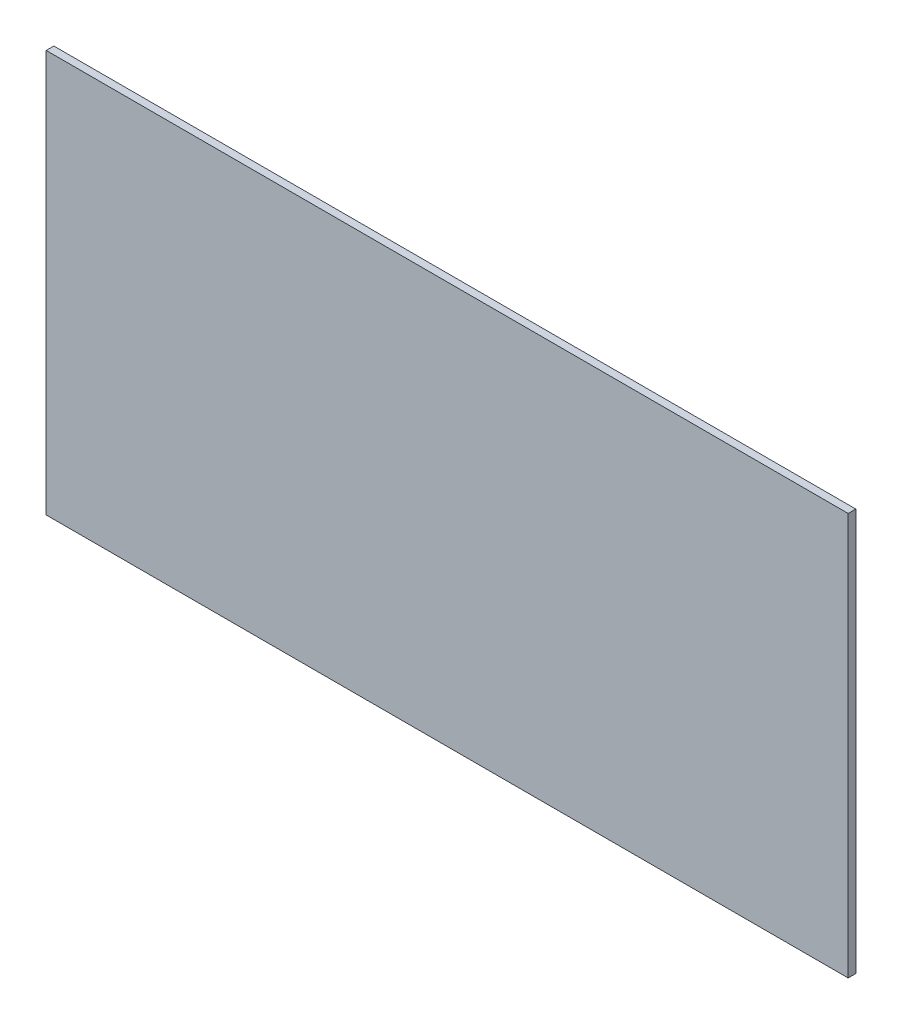
ISO-10303-21;
HEADER;
FILE_DESCRIPTION(('STEP AP214'),'2;1');
FILE_NAME('part.step','',(''),(''),'','','');
FILE_SCHEMA(('AUTOMOTIVE_DESIGN { 1 0 10303 214 1 1 1 1 }'));
ENDSEC;
DATA;
#1=APPLICATION_CONTEXT('core data for automotive mechanical design processes');
#2=APPLICATION_PROTOCOL_DEFINITION('international standard','automotive_design',2000,#1);
#3=PRODUCT_CONTEXT('',#1,'mechanical');
#4=PRODUCT('Part','Part','',(#3));
#5=PRODUCT_RELATED_PRODUCT_CATEGORY('part','',(#4));
#6=PRODUCT_DEFINITION_FORMATION('','',#4);
#7=PRODUCT_DEFINITION_CONTEXT('part definition',#1,'design');
#8=PRODUCT_DEFINITION('design','',#6,#7);
#9=PRODUCT_DEFINITION_SHAPE('','',#8);
#10=(LENGTH_UNIT() NAMED_UNIT(*) SI_UNIT(.MILLI.,.METRE.));
#11=(NAMED_UNIT(*) PLANE_ANGLE_UNIT() SI_UNIT($,.RADIAN.));
#12=(NAMED_UNIT(*) SI_UNIT($,.STERADIAN.) SOLID_ANGLE_UNIT());
#13=UNCERTAINTY_MEASURE_WITH_UNIT(LENGTH_MEASURE(1.E-05),#10,'distance_accuracy_value','');
#14=(GEOMETRIC_REPRESENTATION_CONTEXT(3) GLOBAL_UNCERTAINTY_ASSIGNED_CONTEXT((#13)) GLOBAL_UNIT_ASSIGNED_CONTEXT((#10,
#11,#12)) REPRESENTATION_CONTEXT('',''));
#15=CARTESIAN_POINT('',(0.,0.,0.));
#16=DIRECTION('',(0.,0.,1.));
#17=DIRECTION('',(1.,0.,0.));
#18=AXIS2_PLACEMENT_3D('',#15,#16,#17);
#19=CARTESIAN_POINT('',(-50.5876584913119,33.8583312475711,1.));
#20=DIRECTION('',(1.,0.,0.));
#21=DIRECTION('',(0.,0.,-1.));
#22=AXIS2_PLACEMENT_3D('',#19,#20,#21);
#23=PLANE('',#22);
#24=DIRECTION('',(0.,-1.,0.));
#25=VECTOR('',#24,1.);
#26=CARTESIAN_POINT('',(-50.5876584913119,33.8583312475711,0.));
#27=LINE('',#26,#25);
#28=CARTESIAN_POINT('',(-50.5876584913119,33.8583312475711,0.));
#29=VERTEX_POINT('',#28);
#30=CARTESIAN_POINT('',(-50.5876584913119,-18.7848077242005,0.));
#31=VERTEX_POINT('',#30);
#32=EDGE_CURVE('E107',#29,#31,#27,.T.);
#33=ORIENTED_EDGE('',*,*,#32,.T.);
#34=DIRECTION('',(0.,0.,-1.));
#35=VECTOR('',#34,1.);
#36=CARTESIAN_POINT('',(-50.5876584913119,-18.7848077242005,1.));
#37=LINE('',#36,#35);
#38=CARTESIAN_POINT('',(-50.5876584913119,-18.7848077242005,1.));
#39=VERTEX_POINT('',#38);
#40=EDGE_CURVE('E11',#39,#31,#37,.T.);
#41=ORIENTED_EDGE('',*,*,#40,.F.);
#42=DIRECTION('',(0.,-1.,0.));
#43=VECTOR('',#42,1.);
#44=CARTESIAN_POINT('',(-50.5876584913119,33.8583312475711,1.));
#45=LINE('',#44,#43);
#46=CARTESIAN_POINT('',(-50.5876584913119,33.8583312475711,1.));
#47=VERTEX_POINT('',#46);
#48=EDGE_CURVE('E91',#47,#39,#45,.T.);
#49=ORIENTED_EDGE('',*,*,#48,.F.);
#50=DIRECTION('',(0.,0.,-1.));
#51=VECTOR('',#50,1.);
#52=CARTESIAN_POINT('',(-50.5876584913119,33.8583312475711,1.));
#53=LINE('',#52,#51);
#54=EDGE_CURVE('E103',#47,#29,#53,.T.);
#55=ORIENTED_EDGE('',*,*,#54,.T.);
#56=EDGE_LOOP('',(#33,#41,#49,#55));
#57=FACE_BOUND('',#56,.T.);
#58=ADVANCED_FACE('F39',(#57),#23,.F.);
#59=CARTESIAN_POINT('',(-50.5876584913119,-18.7848077242005,1.));
#60=DIRECTION('',(0.,1.,0.));
#61=DIRECTION('',(0.,0.,1.));
#62=AXIS2_PLACEMENT_3D('',#59,#60,#61);
#63=PLANE('',#62);
#64=DIRECTION('',(1.,0.,0.));
#65=VECTOR('',#64,1.);
#66=CARTESIAN_POINT('',(-50.5876584913119,-18.7848077242005,0.));
#67=LINE('',#66,#65);
#68=CARTESIAN_POINT('',(54.3560393721545,-18.7848077242005,0.));
#69=VERTEX_POINT('',#68);
#70=EDGE_CURVE('E96',#31,#69,#67,.T.);
#71=ORIENTED_EDGE('',*,*,#70,.T.);
#72=DIRECTION('',(0.,0.,-1.));
#73=VECTOR('',#72,1.);
#74=CARTESIAN_POINT('',(54.3560393721545,-18.7848077242005,1.));
#75=LINE('',#74,#73);
#76=CARTESIAN_POINT('',(54.3560393721545,-18.7848077242005,1.));
#77=VERTEX_POINT('',#76);
#78=EDGE_CURVE('E48',#77,#69,#75,.T.);
#79=ORIENTED_EDGE('',*,*,#78,.F.);
#80=DIRECTION('',(1.,0.,0.));
#81=VECTOR('',#80,1.);
#82=CARTESIAN_POINT('',(-50.5876584913119,-18.7848077242005,1.));
#83=LINE('',#82,#81);
#84=EDGE_CURVE('E86',#39,#77,#83,.T.);
#85=ORIENTED_EDGE('',*,*,#84,.F.);
#86=ORIENTED_EDGE('',*,*,#40,.T.);
#87=EDGE_LOOP('',(#71,#79,#85,#86));
#88=FACE_BOUND('',#87,.T.);
#89=ADVANCED_FACE('F95',(#88),#63,.F.);
#90=CARTESIAN_POINT('',(54.3560393721545,33.8583312475711,1.));
#91=DIRECTION('',(-1.,0.,0.));
#92=DIRECTION('',(0.,0.,1.));
#93=AXIS2_PLACEMENT_3D('',#90,#91,#92);
#94=PLANE('',#93);
#95=DIRECTION('',(0.,1.,0.));
#96=VECTOR('',#95,1.);
#97=CARTESIAN_POINT('',(54.3560393721545,33.8583312475711,0.));
#98=LINE('',#97,#96);
#99=CARTESIAN_POINT('',(54.3560393721545,33.8583312475711,0.));
#100=VERTEX_POINT('',#99);
#101=EDGE_CURVE('E73',#69,#100,#98,.T.);
#102=ORIENTED_EDGE('',*,*,#101,.T.);
#103=DIRECTION('',(0.,0.,-1.));
#104=VECTOR('',#103,1.);
#105=CARTESIAN_POINT('',(54.3560393721545,33.8583312475711,1.));
#106=LINE('',#105,#104);
#107=CARTESIAN_POINT('',(54.3560393721545,33.8583312475711,1.));
#108=VERTEX_POINT('',#107);
#109=EDGE_CURVE('E98',#108,#100,#106,.T.);
#110=ORIENTED_EDGE('',*,*,#109,.F.);
#111=DIRECTION('',(0.,1.,0.));
#112=VECTOR('',#111,1.);
#113=CARTESIAN_POINT('',(54.3560393721545,33.8583312475711,1.));
#114=LINE('',#113,#112);
#115=EDGE_CURVE('E89',#77,#108,#114,.T.);
#116=ORIENTED_EDGE('',*,*,#115,.F.);
#117=ORIENTED_EDGE('',*,*,#78,.T.);
#118=EDGE_LOOP('',(#102,#110,#116,#117));
#119=FACE_BOUND('',#118,.T.);
#120=ADVANCED_FACE('F99',(#119),#94,.F.);
#121=CARTESIAN_POINT('',(-50.5876584913119,33.8583312475711,1.));
#122=DIRECTION('',(0.,-1.,0.));
#123=DIRECTION('',(0.,0.,-1.));
#124=AXIS2_PLACEMENT_3D('',#121,#122,#123);
#125=PLANE('',#124);
#126=DIRECTION('',(-1.,0.,0.));
#127=VECTOR('',#126,1.);
#128=CARTESIAN_POINT('',(-50.5876584913119,33.8583312475711,0.));
#129=LINE('',#128,#127);
#130=EDGE_CURVE('E79',#100,#29,#129,.T.);
#131=ORIENTED_EDGE('',*,*,#130,.T.);
#132=ORIENTED_EDGE('',*,*,#54,.F.);
#133=DIRECTION('',(-1.,0.,0.));
#134=VECTOR('',#133,1.);
#135=CARTESIAN_POINT('',(-50.5876584913119,33.8583312475711,1.));
#136=LINE('',#135,#134);
#137=EDGE_CURVE('E56',#108,#47,#136,.T.);
#138=ORIENTED_EDGE('',*,*,#137,.F.);
#139=ORIENTED_EDGE('',*,*,#109,.T.);
#140=EDGE_LOOP('',(#131,#132,#138,#139));
#141=FACE_BOUND('',#140,.T.);
#142=ADVANCED_FACE('F120',(#141),#125,.F.);
#143=CARTESIAN_POINT('',(0.,0.,1.));
#144=DIRECTION('',(0.,0.,1.));
#145=DIRECTION('',(1.,0.,0.));
#146=AXIS2_PLACEMENT_3D('',#143,#144,#145);
#147=PLANE('',#146);
#148=ORIENTED_EDGE('',*,*,#48,.T.);
#149=ORIENTED_EDGE('',*,*,#84,.T.);
#150=ORIENTED_EDGE('',*,*,#115,.T.);
#151=ORIENTED_EDGE('',*,*,#137,.T.);
#152=EDGE_LOOP('',(#148,#149,#150,#151));
#153=FACE_BOUND('',#152,.T.);
#154=ADVANCED_FACE('F87',(#153),#147,.T.);
#155=CARTESIAN_POINT('',(0.,0.,0.));
#156=DIRECTION('',(0.,0.,1.));
#157=DIRECTION('',(1.,0.,0.));
#158=AXIS2_PLACEMENT_3D('',#155,#156,#157);
#159=PLANE('',#158);
#160=ORIENTED_EDGE('',*,*,#32,.F.);
#161=ORIENTED_EDGE('',*,*,#130,.F.);
#162=ORIENTED_EDGE('',*,*,#101,.F.);
#163=ORIENTED_EDGE('',*,*,#70,.F.);
#164=EDGE_LOOP('',(#160,#161,#162,#163));
#165=FACE_BOUND('',#164,.T.);
#166=ADVANCED_FACE('F123',(#165),#159,.F.);
#167=CLOSED_SHELL('',(#58,#89,#120,#142,#154,#166));
#168=MANIFOLD_SOLID_BREP('B2',#167);
#169=ADVANCED_BREP_SHAPE_REPRESENTATION('',(#18,#168),#14);
#170=SHAPE_DEFINITION_REPRESENTATION(#9,#169);
ENDSEC;
END-ISO-10303-21;
